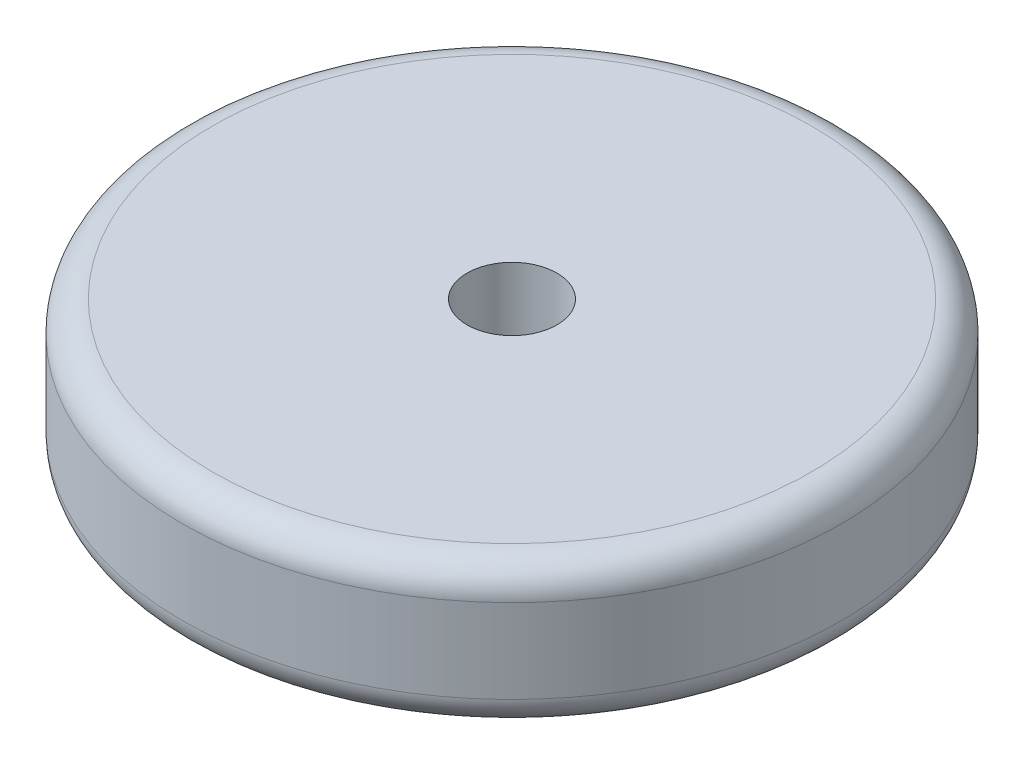
ISO-10303-21;
HEADER;
FILE_DESCRIPTION(('STEP AP214'),'2;1');
FILE_NAME('part.step','',(''),(''),'','','');
FILE_SCHEMA(('AUTOMOTIVE_DESIGN { 1 0 10303 214 1 1 1 1 }'));
ENDSEC;
DATA;
#1=APPLICATION_CONTEXT('core data for automotive mechanical design processes');
#2=APPLICATION_PROTOCOL_DEFINITION('international standard','automotive_design',2000,#1);
#3=PRODUCT_CONTEXT('',#1,'mechanical');
#4=PRODUCT('Part','Part','',(#3));
#5=PRODUCT_RELATED_PRODUCT_CATEGORY('part','',(#4));
#6=PRODUCT_DEFINITION_FORMATION('','',#4);
#7=PRODUCT_DEFINITION_CONTEXT('part definition',#1,'design');
#8=PRODUCT_DEFINITION('design','',#6,#7);
#9=PRODUCT_DEFINITION_SHAPE('','',#8);
#10=(LENGTH_UNIT() NAMED_UNIT(*) SI_UNIT(.MILLI.,.METRE.));
#11=(NAMED_UNIT(*) PLANE_ANGLE_UNIT() SI_UNIT($,.RADIAN.));
#12=(NAMED_UNIT(*) SI_UNIT($,.STERADIAN.) SOLID_ANGLE_UNIT());
#13=UNCERTAINTY_MEASURE_WITH_UNIT(LENGTH_MEASURE(1.E-05),#10,'distance_accuracy_value','');
#14=(GEOMETRIC_REPRESENTATION_CONTEXT(3) GLOBAL_UNCERTAINTY_ASSIGNED_CONTEXT((#13)) GLOBAL_UNIT_ASSIGNED_CONTEXT((#10,
#11,#12)) REPRESENTATION_CONTEXT('',''));
#15=CARTESIAN_POINT('',(0.,0.,0.));
#16=DIRECTION('',(0.,0.,1.));
#17=DIRECTION('',(1.,0.,0.));
#18=AXIS2_PLACEMENT_3D('',#15,#16,#17);
#19=CARTESIAN_POINT('',(0.,15.24,0.));
#20=DIRECTION('',(0.,-1.,0.));
#21=DIRECTION('',(0.,0.,-1.));
#22=AXIS2_PLACEMENT_3D('',#19,#20,#21);
#23=CYLINDRICAL_SURFACE('',#22,69.85);
#24=CARTESIAN_POINT('',(0.,-8.89,0.));
#25=DIRECTION('',(0.,1.,0.));
#26=DIRECTION('',(0.,0.,1.));
#27=AXIS2_PLACEMENT_3D('',#24,#25,#26);
#28=CIRCLE('',#27,69.85);
#29=CARTESIAN_POINT('',(0.,-8.89,-69.85));
#30=VERTEX_POINT('',#29);
#31=EDGE_CURVE('E52',#30,#30,#28,.T.);
#32=CARTESIAN_POINT('',(0.,8.89,0.));
#33=DIRECTION('',(0.,1.,0.));
#34=DIRECTION('',(0.,0.,1.));
#35=AXIS2_PLACEMENT_3D('',#32,#33,#34);
#36=CIRCLE('',#35,69.85);
#37=CARTESIAN_POINT('',(0.,8.89,-69.85));
#38=VERTEX_POINT('',#37);
#39=EDGE_CURVE('E57',#38,#38,#36,.F.);
#40=CARTESIAN_POINT('',(0.,-8.89,-69.85));
#41=CARTESIAN_POINT('',(0.,-8.70479166666667,-69.85));
#42=CARTESIAN_POINT('',(0.,-8.51958333333334,-69.85));
#43=CARTESIAN_POINT('',(0.,-8.14916666666667,-69.85));
#44=CARTESIAN_POINT('',(0.,-7.96395833333334,-69.85));
#45=CARTESIAN_POINT('',(0.,-7.59354166666667,-69.85));
#46=CARTESIAN_POINT('',(0.,-7.40833333333333,-69.85));
#47=CARTESIAN_POINT('',(0.,-7.03791666666667,-69.85));
#48=CARTESIAN_POINT('',(0.,-6.85270833333333,-69.85));
#49=CARTESIAN_POINT('',(0.,-6.48229166666667,-69.85));
#50=CARTESIAN_POINT('',(0.,-6.29708333333334,-69.85));
#51=CARTESIAN_POINT('',(0.,-5.92666666666667,-69.85));
#52=CARTESIAN_POINT('',(0.,-5.74145833333334,-69.85));
#53=CARTESIAN_POINT('',(0.,-5.37104166666667,-69.85));
#54=CARTESIAN_POINT('',(0.,-5.18583333333334,-69.85));
#55=CARTESIAN_POINT('',(0.,-4.81541666666667,-69.85));
#56=CARTESIAN_POINT('',(0.,-4.63020833333334,-69.85));
#57=CARTESIAN_POINT('',(0.,-4.25979166666667,-69.85));
#58=CARTESIAN_POINT('',(0.,-4.07458333333334,-69.85));
#59=CARTESIAN_POINT('',(0.,-3.70416666666667,-69.85));
#60=CARTESIAN_POINT('',(0.,-3.51895833333334,-69.85));
#61=CARTESIAN_POINT('',(0.,-3.14854166666667,-69.85));
#62=CARTESIAN_POINT('',(0.,-2.96333333333333,-69.85));
#63=CARTESIAN_POINT('',(0.,-2.59291666666667,-69.85));
#64=CARTESIAN_POINT('',(0.,-2.40770833333334,-69.85));
#65=CARTESIAN_POINT('',(0.,-2.03729166666667,-69.85));
#66=CARTESIAN_POINT('',(0.,-1.85208333333333,-69.85));
#67=CARTESIAN_POINT('',(0.,-1.48166666666667,-69.85));
#68=CARTESIAN_POINT('',(0.,-1.29645833333334,-69.85));
#69=CARTESIAN_POINT('',(0.,-0.926041666666669,-69.85));
#70=CARTESIAN_POINT('',(0.,-0.740833333333336,-69.85));
#71=CARTESIAN_POINT('',(0.,-0.370416666666669,-69.85));
#72=CARTESIAN_POINT('',(0.,-0.185208333333336,-69.85));
#73=CARTESIAN_POINT('',(0.,0.18520833333333,-69.85));
#74=CARTESIAN_POINT('',(0.,0.370416666666664,-69.85));
#75=CARTESIAN_POINT('',(0.,0.740833333333331,-69.85));
#76=CARTESIAN_POINT('',(0.,0.926041666666664,-69.85));
#77=CARTESIAN_POINT('',(0.,1.29645833333333,-69.85));
#78=CARTESIAN_POINT('',(0.,1.48166666666666,-69.85));
#79=CARTESIAN_POINT('',(0.,1.85208333333333,-69.85));
#80=CARTESIAN_POINT('',(0.,2.03729166666666,-69.85));
#81=CARTESIAN_POINT('',(0.,2.40770833333333,-69.85));
#82=CARTESIAN_POINT('',(0.,2.59291666666666,-69.85));
#83=CARTESIAN_POINT('',(0.,2.96333333333333,-69.85));
#84=CARTESIAN_POINT('',(0.,3.14854166666666,-69.85));
#85=CARTESIAN_POINT('',(0.,3.51895833333333,-69.85));
#86=CARTESIAN_POINT('',(0.,3.70416666666666,-69.85));
#87=CARTESIAN_POINT('',(0.,4.07458333333333,-69.85));
#88=CARTESIAN_POINT('',(0.,4.25979166666666,-69.85));
#89=CARTESIAN_POINT('',(0.,4.63020833333333,-69.85));
#90=CARTESIAN_POINT('',(0.,4.81541666666666,-69.85));
#91=CARTESIAN_POINT('',(0.,5.18583333333333,-69.85));
#92=CARTESIAN_POINT('',(0.,5.37104166666667,-69.85));
#93=CARTESIAN_POINT('',(0.,5.74145833333333,-69.85));
#94=CARTESIAN_POINT('',(0.,5.92666666666666,-69.85));
#95=CARTESIAN_POINT('',(0.,6.29708333333333,-69.85));
#96=CARTESIAN_POINT('',(0.,6.48229166666667,-69.85));
#97=CARTESIAN_POINT('',(0.,6.85270833333333,-69.85));
#98=CARTESIAN_POINT('',(0.,7.03791666666666,-69.85));
#99=CARTESIAN_POINT('',(0.,7.40833333333333,-69.85));
#100=CARTESIAN_POINT('',(0.,7.59354166666666,-69.85));
#101=CARTESIAN_POINT('',(0.,7.96395833333333,-69.85));
#102=CARTESIAN_POINT('',(0.,8.14916666666666,-69.85));
#103=CARTESIAN_POINT('',(0.,8.51958333333333,-69.85));
#104=CARTESIAN_POINT('',(0.,8.70479166666667,-69.85));
#105=CARTESIAN_POINT('',(0.,8.89,-69.85));
#106=B_SPLINE_CURVE_WITH_KNOTS('',3,(#40,#41,#42,#43,#44,#45,#46,#47,#48,#49,#50,#51,#52,#53,
#54,#55,#56,#57,#58,#59,#60,#61,#62,#63,#64,#65,#66,#67,#68,#69,#70,#71,#72,#73,#74,#75,#76,#77,
#78,#79,#80,#81,#82,#83,#84,#85,#86,#87,#88,#89,#90,#91,#92,#93,#94,#95,#96,#97,#98,#99,#100,
#101,#102,#103,#104,#105),.UNSPECIFIED.,.F.,.F.,(4,2,2,2,2,2,2,2,2,2,2,2,2,2,2,2,2,2,2,2,2,2,2,
2,2,2,2,2,2,2,2,2,4),(0.,0.555625000000001,1.11125,1.666875,2.2225,2.778125,3.33375,3.889375,
4.445,5.000625,5.55625,6.111875,6.6675,7.223125,7.77875,8.334375,8.89,9.445625,10.00125,
10.556875,11.1125,11.668125,12.22375,12.779375,13.335,13.890625,14.44625,15.001875,15.5575,
16.113125,16.66875,17.224375,17.78),.UNSPECIFIED.);
#107=EDGE_CURVE('BSEAM39',#30,#38,#106,.T.);
#108=ORIENTED_EDGE('',*,*,#31,.T.);
#109=ORIENTED_EDGE('',*,*,#39,.T.);
#110=ORIENTED_EDGE('',*,*,#107,.T.);
#111=ORIENTED_EDGE('',*,*,#107,.F.);
#112=EDGE_LOOP('',(#108,#110,#109,#111));
#113=FACE_BOUND('',#112,.T.);
#114=ADVANCED_FACE('F39',(#113),#23,.T.);
#115=CARTESIAN_POINT('',(0.,15.24,0.));
#116=DIRECTION('',(0.,1.,0.));
#117=DIRECTION('',(0.,0.,1.));
#118=AXIS2_PLACEMENT_3D('',#115,#116,#117);
#119=PLANE('',#118);
#120=CARTESIAN_POINT('',(0.,15.24,0.));
#121=DIRECTION('',(0.,1.,0.));
#122=DIRECTION('',(0.,0.,1.));
#123=AXIS2_PLACEMENT_3D('',#120,#121,#122);
#124=CIRCLE('',#123,63.5);
#125=CARTESIAN_POINT('',(0.,15.24,63.5));
#126=VERTEX_POINT('',#125);
#127=EDGE_CURVE('E10',#126,#126,#124,.T.);
#128=ORIENTED_EDGE('',*,*,#127,.T.);
#129=EDGE_LOOP('',(#128));
#130=FACE_BOUND('',#129,.T.);
#131=CARTESIAN_POINT('',(0.,15.24,0.));
#132=DIRECTION('',(0.,1.,0.));
#133=DIRECTION('',(0.,0.,1.));
#134=AXIS2_PLACEMENT_3D('',#131,#132,#133);
#135=CIRCLE('',#134,9.525);
#136=CARTESIAN_POINT('',(0.,15.24,9.525));
#137=VERTEX_POINT('',#136);
#138=EDGE_CURVE('E63',#137,#137,#135,.T.);
#139=ORIENTED_EDGE('',*,*,#138,.F.);
#140=EDGE_LOOP('',(#139));
#141=FACE_BOUND('',#140,.T.);
#142=ADVANCED_FACE('F79',(#130,#141),#119,.T.);
#143=CARTESIAN_POINT('',(0.,-15.24,0.));
#144=DIRECTION('',(0.,1.,0.));
#145=DIRECTION('',(0.,0.,1.));
#146=AXIS2_PLACEMENT_3D('',#143,#144,#145);
#147=PLANE('',#146);
#148=CARTESIAN_POINT('',(0.,-15.24,0.));
#149=DIRECTION('',(0.,1.,0.));
#150=DIRECTION('',(0.,0.,1.));
#151=AXIS2_PLACEMENT_3D('',#148,#149,#150);
#152=CIRCLE('',#151,63.5);
#153=CARTESIAN_POINT('',(0.,-15.24,63.5));
#154=VERTEX_POINT('',#153);
#155=EDGE_CURVE('E47',#154,#154,#152,.F.);
#156=ORIENTED_EDGE('',*,*,#155,.T.);
#157=EDGE_LOOP('',(#156));
#158=FACE_BOUND('',#157,.T.);
#159=CARTESIAN_POINT('',(0.,-15.24,0.));
#160=DIRECTION('',(0.,1.,0.));
#161=DIRECTION('',(0.,0.,1.));
#162=AXIS2_PLACEMENT_3D('',#159,#160,#161);
#163=CIRCLE('',#162,9.525);
#164=CARTESIAN_POINT('',(0.,-15.24,9.525));
#165=VERTEX_POINT('',#164);
#166=EDGE_CURVE('E62',#165,#165,#163,.T.);
#167=ORIENTED_EDGE('',*,*,#166,.T.);
#168=EDGE_LOOP('',(#167));
#169=FACE_BOUND('',#168,.T.);
#170=ADVANCED_FACE('F70',(#158,#169),#147,.F.);
#171=CARTESIAN_POINT('',(0.,-15.24,0.));
#172=DIRECTION('',(0.,1.,0.));
#173=DIRECTION('',(0.,0.,1.));
#174=AXIS2_PLACEMENT_3D('',#171,#172,#173);
#175=CYLINDRICAL_SURFACE('',#174,9.525);
#176=CARTESIAN_POINT('',(0.,-15.24,9.525));
#177=CARTESIAN_POINT('',(0.,-14.9225,9.525));
#178=CARTESIAN_POINT('',(0.,-14.605,9.525));
#179=CARTESIAN_POINT('',(0.,-13.97,9.525));
#180=CARTESIAN_POINT('',(0.,-13.6525,9.525));
#181=CARTESIAN_POINT('',(0.,-13.0175,9.525));
#182=CARTESIAN_POINT('',(0.,-12.7,9.525));
#183=CARTESIAN_POINT('',(0.,-12.065,9.525));
#184=CARTESIAN_POINT('',(0.,-11.7475,9.525));
#185=CARTESIAN_POINT('',(0.,-11.1125,9.525));
#186=CARTESIAN_POINT('',(0.,-10.795,9.525));
#187=CARTESIAN_POINT('',(0.,-10.16,9.525));
#188=CARTESIAN_POINT('',(0.,-9.8425,9.525));
#189=CARTESIAN_POINT('',(0.,-9.2075,9.525));
#190=CARTESIAN_POINT('',(0.,-8.89,9.525));
#191=CARTESIAN_POINT('',(0.,-8.255,9.525));
#192=CARTESIAN_POINT('',(0.,-7.9375,9.525));
#193=CARTESIAN_POINT('',(0.,-7.3025,9.525));
#194=CARTESIAN_POINT('',(0.,-6.985,9.525));
#195=CARTESIAN_POINT('',(0.,-6.35,9.525));
#196=CARTESIAN_POINT('',(0.,-6.0325,9.525));
#197=CARTESIAN_POINT('',(0.,-5.3975,9.525));
#198=CARTESIAN_POINT('',(0.,-5.08,9.525));
#199=CARTESIAN_POINT('',(0.,-4.445,9.525));
#200=CARTESIAN_POINT('',(0.,-4.1275,9.525));
#201=CARTESIAN_POINT('',(0.,-3.4925,9.525));
#202=CARTESIAN_POINT('',(0.,-3.175,9.525));
#203=CARTESIAN_POINT('',(0.,-2.54,9.525));
#204=CARTESIAN_POINT('',(0.,-2.2225,9.525));
#205=CARTESIAN_POINT('',(0.,-1.5875,9.525));
#206=CARTESIAN_POINT('',(0.,-1.27,9.525));
#207=CARTESIAN_POINT('',(0.,-0.635,9.525));
#208=CARTESIAN_POINT('',(0.,-0.3175,9.525));
#209=CARTESIAN_POINT('',(0.,0.317499999999999,9.525));
#210=CARTESIAN_POINT('',(0.,0.634999999999998,9.525));
#211=CARTESIAN_POINT('',(0.,1.27,9.525));
#212=CARTESIAN_POINT('',(0.,1.5875,9.525));
#213=CARTESIAN_POINT('',(0.,2.2225,9.525));
#214=CARTESIAN_POINT('',(0.,2.54,9.525));
#215=CARTESIAN_POINT('',(0.,3.175,9.525));
#216=CARTESIAN_POINT('',(0.,3.4925,9.525));
#217=CARTESIAN_POINT('',(0.,4.1275,9.525));
#218=CARTESIAN_POINT('',(0.,4.445,9.525));
#219=CARTESIAN_POINT('',(0.,5.08,9.525));
#220=CARTESIAN_POINT('',(0.,5.3975,9.525));
#221=CARTESIAN_POINT('',(0.,6.0325,9.525));
#222=CARTESIAN_POINT('',(0.,6.35,9.525));
#223=CARTESIAN_POINT('',(0.,6.985,9.525));
#224=CARTESIAN_POINT('',(0.,7.3025,9.525));
#225=CARTESIAN_POINT('',(0.,7.9375,9.525));
#226=CARTESIAN_POINT('',(0.,8.255,9.525));
#227=CARTESIAN_POINT('',(0.,8.89,9.525));
#228=CARTESIAN_POINT('',(0.,9.2075,9.525));
#229=CARTESIAN_POINT('',(0.,9.8425,9.525));
#230=CARTESIAN_POINT('',(0.,10.16,9.525));
#231=CARTESIAN_POINT('',(0.,10.795,9.525));
#232=CARTESIAN_POINT('',(0.,11.1125,9.525));
#233=CARTESIAN_POINT('',(0.,11.7475,9.525));
#234=CARTESIAN_POINT('',(0.,12.065,9.525));
#235=CARTESIAN_POINT('',(0.,12.7,9.525));
#236=CARTESIAN_POINT('',(0.,13.0175,9.525));
#237=CARTESIAN_POINT('',(0.,13.6525,9.525));
#238=CARTESIAN_POINT('',(0.,13.97,9.525));
#239=CARTESIAN_POINT('',(0.,14.605,9.525));
#240=CARTESIAN_POINT('',(0.,14.9225,9.525));
#241=CARTESIAN_POINT('',(0.,15.24,9.525));
#242=B_SPLINE_CURVE_WITH_KNOTS('',3,(#176,#177,#178,#179,#180,#181,#182,#183,#184,#185,#186,
#187,#188,#189,#190,#191,#192,#193,#194,#195,#196,#197,#198,#199,#200,#201,#202,#203,#204,#205,
#206,#207,#208,#209,#210,#211,#212,#213,#214,#215,#216,#217,#218,#219,#220,#221,#222,#223,#224,
#225,#226,#227,#228,#229,#230,#231,#232,#233,#234,#235,#236,#237,#238,#239,#240,#241),
.UNSPECIFIED.,.F.,.F.,(4,2,2,2,2,2,2,2,2,2,2,2,2,2,2,2,2,2,2,2,2,2,2,2,2,2,2,2,2,2,2,2,4),(0.,
0.952499999999998,1.905,2.8575,3.81,4.7625,5.715,6.6675,7.62,8.5725,9.525,10.4775,11.43,12.3825,
13.335,14.2875,15.24,16.1925,17.145,18.0975,19.05,20.0025,20.955,21.9075,22.86,23.8125,24.765,
25.7175,26.67,27.6225,28.575,29.5275,30.48),.UNSPECIFIED.);
#243=EDGE_CURVE('BSEAM72',#165,#137,#242,.T.);
#244=ORIENTED_EDGE('',*,*,#166,.F.);
#245=ORIENTED_EDGE('',*,*,#138,.T.);
#246=ORIENTED_EDGE('',*,*,#243,.T.);
#247=ORIENTED_EDGE('',*,*,#243,.F.);
#248=EDGE_LOOP('',(#244,#246,#245,#247));
#249=FACE_BOUND('',#248,.T.);
#250=ADVANCED_FACE('F72',(#249),#175,.F.);
#251=CARTESIAN_POINT('',(0.,-8.89,0.));
#252=DIRECTION('',(0.,1.,0.));
#253=DIRECTION('',(0.,0.,1.));
#254=AXIS2_PLACEMENT_3D('',#251,#252,#253);
#255=TOROIDAL_SURFACE('',#254,63.5,6.35);
#256=ORIENTED_EDGE('',*,*,#155,.F.);
#257=EDGE_LOOP('',(#256));
#258=FACE_BOUND('',#257,.T.);
#259=ORIENTED_EDGE('',*,*,#31,.F.);
#260=EDGE_LOOP('',(#259));
#261=FACE_BOUND('',#260,.T.);
#262=ADVANCED_FACE('F75',(#258,#261),#255,.T.);
#263=CARTESIAN_POINT('',(0.,8.89,0.));
#264=DIRECTION('',(0.,1.,0.));
#265=DIRECTION('',(0.,0.,1.));
#266=AXIS2_PLACEMENT_3D('',#263,#264,#265);
#267=TOROIDAL_SURFACE('',#266,63.5,6.35);
#268=ORIENTED_EDGE('',*,*,#39,.F.);
#269=EDGE_LOOP('',(#268));
#270=FACE_BOUND('',#269,.T.);
#271=ORIENTED_EDGE('',*,*,#127,.F.);
#272=EDGE_LOOP('',(#271));
#273=FACE_BOUND('',#272,.T.);
#274=ADVANCED_FACE('F41',(#270,#273),#267,.T.);
#275=CLOSED_SHELL('',(#114,#142,#170,#250,#262,#274));
#276=MANIFOLD_SOLID_BREP('B2',#275);
#277=ADVANCED_BREP_SHAPE_REPRESENTATION('',(#18,#276),#14);
#278=SHAPE_DEFINITION_REPRESENTATION(#9,#277);
ENDSEC;
END-ISO-10303-21;
